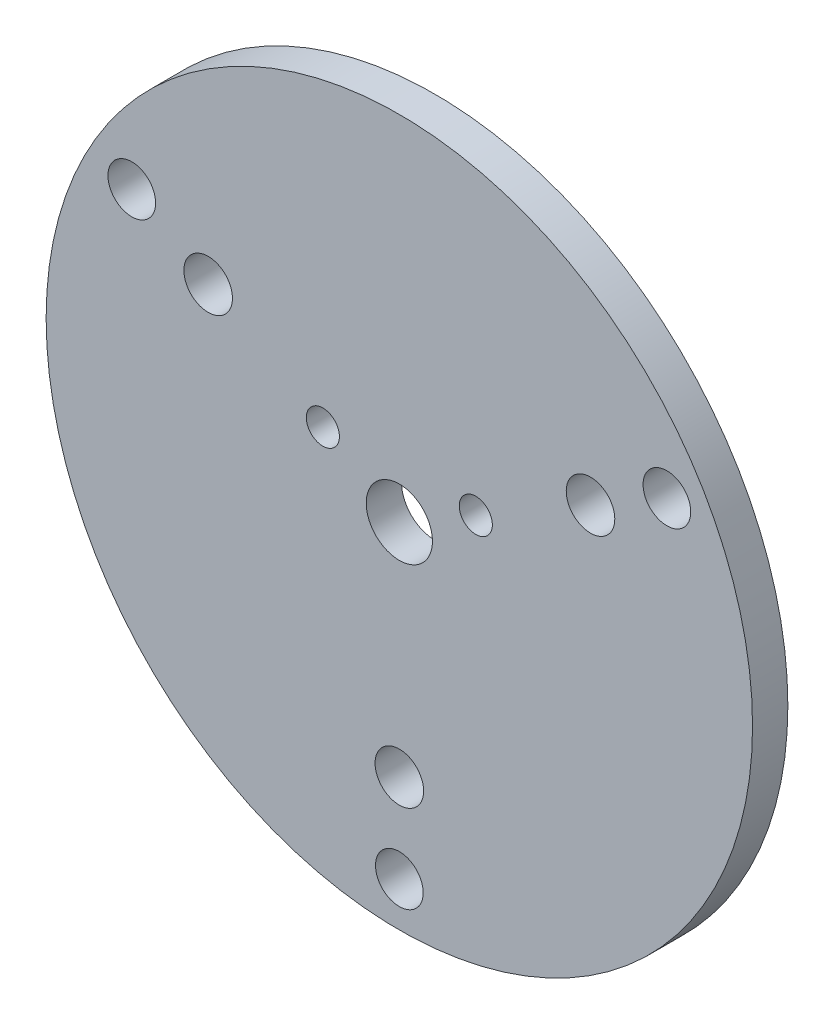
ISO-10303-21;
HEADER;
FILE_DESCRIPTION(('STEP AP214'),'2;1');
FILE_NAME('part.step','',(''),(''),'','','');
FILE_SCHEMA(('AUTOMOTIVE_DESIGN { 1 0 10303 214 1 1 1 1 }'));
ENDSEC;
DATA;
#1=APPLICATION_CONTEXT('core data for automotive mechanical design processes');
#2=APPLICATION_PROTOCOL_DEFINITION('international standard','automotive_design',2000,#1);
#3=PRODUCT_CONTEXT('',#1,'mechanical');
#4=PRODUCT('Part','Part','',(#3));
#5=PRODUCT_RELATED_PRODUCT_CATEGORY('part','',(#4));
#6=PRODUCT_DEFINITION_FORMATION('','',#4);
#7=PRODUCT_DEFINITION_CONTEXT('part definition',#1,'design');
#8=PRODUCT_DEFINITION('design','',#6,#7);
#9=PRODUCT_DEFINITION_SHAPE('','',#8);
#10=(LENGTH_UNIT() NAMED_UNIT(*) SI_UNIT(.MILLI.,.METRE.));
#11=(NAMED_UNIT(*) PLANE_ANGLE_UNIT() SI_UNIT($,.RADIAN.));
#12=(NAMED_UNIT(*) SI_UNIT($,.STERADIAN.) SOLID_ANGLE_UNIT());
#13=UNCERTAINTY_MEASURE_WITH_UNIT(LENGTH_MEASURE(1.E-05),#10,'distance_accuracy_value','');
#14=(GEOMETRIC_REPRESENTATION_CONTEXT(3) GLOBAL_UNCERTAINTY_ASSIGNED_CONTEXT((#13)) GLOBAL_UNIT_ASSIGNED_CONTEXT((#10,
#11,#12)) REPRESENTATION_CONTEXT('',''));
#15=CARTESIAN_POINT('',(0.,0.,0.));
#16=DIRECTION('',(0.,0.,1.));
#17=DIRECTION('',(1.,0.,0.));
#18=AXIS2_PLACEMENT_3D('',#15,#16,#17);
#19=CARTESIAN_POINT('',(12.12,7.,0.));
#20=DIRECTION('',(0.,0.,-1.));
#21=DIRECTION('',(1.,0.,0.));
#22=AXIS2_PLACEMENT_3D('',#19,#20,#21);
#23=CYLINDRICAL_SURFACE('',#22,1.08);
#24=DIRECTION('',(0.,0.,1.));
#25=VECTOR('',#24,1.);
#26=CARTESIAN_POINT('',(13.2,7.,0.));
#27=LINE('',#26,#25);
#28=CARTESIAN_POINT('',(13.2,7.,0.));
#29=VERTEX_POINT('',#28);
#30=CARTESIAN_POINT('',(13.2,7.,1.6));
#31=VERTEX_POINT('',#30);
#32=EDGE_CURVE('E11',#29,#31,#27,.T.);
#33=ORIENTED_EDGE('',*,*,#32,.T.);
#34=CARTESIAN_POINT('',(12.12,7.,1.6));
#35=DIRECTION('',(0.,0.,1.));
#36=DIRECTION('',(1.,0.,0.));
#37=AXIS2_PLACEMENT_3D('',#34,#35,#36);
#38=CIRCLE('',#37,1.08);
#39=EDGE_CURVE('E157',#31,#31,#38,.T.);
#40=ORIENTED_EDGE('',*,*,#39,.T.);
#41=ORIENTED_EDGE('',*,*,#32,.F.);
#42=CARTESIAN_POINT('',(12.12,7.,0.));
#43=DIRECTION('',(0.,0.,1.));
#44=DIRECTION('',(1.,0.,0.));
#45=AXIS2_PLACEMENT_3D('',#42,#43,#44);
#46=CIRCLE('',#45,1.08);
#47=EDGE_CURVE('E166',#29,#29,#46,.T.);
#48=ORIENTED_EDGE('',*,*,#47,.F.);
#49=EDGE_LOOP('',(#33,#40,#41,#48));
#50=FACE_BOUND('',#49,.T.);
#51=ADVANCED_FACE('F17',(#50),#23,.F.);
#52=CARTESIAN_POINT('',(8.66,5.,-0.045));
#53=DIRECTION('',(0.,0.,-1.));
#54=DIRECTION('',(0.,-1.,0.));
#55=AXIS2_PLACEMENT_3D('',#52,#53,#54);
#56=CYLINDRICAL_SURFACE('',#55,1.1);
#57=CARTESIAN_POINT('',(8.66,5.,0.));
#58=DIRECTION('',(0.,0.,-1.));
#59=DIRECTION('',(0.,-1.,0.));
#60=AXIS2_PLACEMENT_3D('',#57,#58,#59);
#61=CIRCLE('',#60,1.1);
#62=CARTESIAN_POINT('',(8.66,3.9,0.));
#63=VERTEX_POINT('',#62);
#64=EDGE_CURVE('E165',#63,#63,#61,.T.);
#65=ORIENTED_EDGE('',*,*,#64,.T.);
#66=DIRECTION('',(0.,0.,1.));
#67=VECTOR('',#66,1.);
#68=CARTESIAN_POINT('',(8.66,3.9,-0.045));
#69=LINE('',#68,#67);
#70=CARTESIAN_POINT('',(8.66,3.9,1.6));
#71=VERTEX_POINT('',#70);
#72=EDGE_CURVE('E25',#63,#71,#69,.T.);
#73=ORIENTED_EDGE('',*,*,#72,.T.);
#74=CARTESIAN_POINT('',(8.66,5.,1.6));
#75=DIRECTION('',(0.,0.,-1.));
#76=DIRECTION('',(0.,-1.,0.));
#77=AXIS2_PLACEMENT_3D('',#74,#75,#76);
#78=CIRCLE('',#77,1.1);
#79=EDGE_CURVE('E202',#71,#71,#78,.T.);
#80=ORIENTED_EDGE('',*,*,#79,.F.);
#81=ORIENTED_EDGE('',*,*,#72,.F.);
#82=EDGE_LOOP('',(#65,#73,#80,#81));
#83=FACE_BOUND('',#82,.T.);
#84=ADVANCED_FACE('F347',(#83),#56,.F.);
#85=CARTESIAN_POINT('',(3.4641,2.,-0.045));
#86=DIRECTION('',(0.,0.,-1.));
#87=DIRECTION('',(0.,-1.,0.));
#88=AXIS2_PLACEMENT_3D('',#85,#86,#87);
#89=CYLINDRICAL_SURFACE('',#88,0.75);
#90=CARTESIAN_POINT('',(3.4641,2.,0.));
#91=DIRECTION('',(0.,0.,-1.));
#92=DIRECTION('',(0.,-1.,0.));
#93=AXIS2_PLACEMENT_3D('',#90,#91,#92);
#94=CIRCLE('',#93,0.75);
#95=CARTESIAN_POINT('',(3.4641,1.25,0.));
#96=VERTEX_POINT('',#95);
#97=EDGE_CURVE('E161',#96,#96,#94,.T.);
#98=ORIENTED_EDGE('',*,*,#97,.T.);
#99=DIRECTION('',(0.,0.,1.));
#100=VECTOR('',#99,1.);
#101=CARTESIAN_POINT('',(3.4641,1.25,-0.045));
#102=LINE('',#101,#100);
#103=CARTESIAN_POINT('',(3.4641,1.25,1.6));
#104=VERTEX_POINT('',#103);
#105=EDGE_CURVE('E216',#96,#104,#102,.T.);
#106=ORIENTED_EDGE('',*,*,#105,.T.);
#107=CARTESIAN_POINT('',(3.4641,2.,1.6));
#108=DIRECTION('',(0.,0.,-1.));
#109=DIRECTION('',(0.,-1.,0.));
#110=AXIS2_PLACEMENT_3D('',#107,#108,#109);
#111=CIRCLE('',#110,0.75);
#112=EDGE_CURVE('E198',#104,#104,#111,.T.);
#113=ORIENTED_EDGE('',*,*,#112,.F.);
#114=ORIENTED_EDGE('',*,*,#105,.F.);
#115=EDGE_LOOP('',(#98,#106,#113,#114));
#116=FACE_BOUND('',#115,.T.);
#117=ADVANCED_FACE('F351',(#116),#89,.F.);
#118=CARTESIAN_POINT('',(0.,0.,0.));
#119=DIRECTION('',(0.,0.,-1.));
#120=DIRECTION('',(1.,0.,0.));
#121=AXIS2_PLACEMENT_3D('',#118,#119,#120);
#122=CYLINDRICAL_SURFACE('',#121,1.5);
#123=DIRECTION('',(0.,0.,1.));
#124=VECTOR('',#123,1.);
#125=CARTESIAN_POINT('',(1.5,0.,0.));
#126=LINE('',#125,#124);
#127=CARTESIAN_POINT('',(1.5,0.,0.));
#128=VERTEX_POINT('',#127);
#129=CARTESIAN_POINT('',(1.5,0.,1.6));
#130=VERTEX_POINT('',#129);
#131=EDGE_CURVE('E213',#128,#130,#126,.T.);
#132=ORIENTED_EDGE('',*,*,#131,.T.);
#133=CARTESIAN_POINT('',(0.,0.,1.6));
#134=DIRECTION('',(0.,0.,1.));
#135=DIRECTION('',(1.,0.,0.));
#136=AXIS2_PLACEMENT_3D('',#133,#134,#135);
#137=CIRCLE('',#136,1.5);
#138=EDGE_CURVE('E194',#130,#130,#137,.T.);
#139=ORIENTED_EDGE('',*,*,#138,.T.);
#140=ORIENTED_EDGE('',*,*,#131,.F.);
#141=CARTESIAN_POINT('',(0.,0.,0.));
#142=DIRECTION('',(0.,0.,1.));
#143=DIRECTION('',(1.,0.,0.));
#144=AXIS2_PLACEMENT_3D('',#141,#142,#143);
#145=CIRCLE('',#144,1.5);
#146=EDGE_CURVE('E152',#128,#128,#145,.T.);
#147=ORIENTED_EDGE('',*,*,#146,.F.);
#148=EDGE_LOOP('',(#132,#139,#140,#147));
#149=FACE_BOUND('',#148,.T.);
#150=ADVANCED_FACE('F355',(#149),#122,.F.);
#151=CARTESIAN_POINT('',(-12.12,7.,0.));
#152=DIRECTION('',(0.,0.,-1.));
#153=DIRECTION('',(1.,0.,0.));
#154=AXIS2_PLACEMENT_3D('',#151,#152,#153);
#155=CYLINDRICAL_SURFACE('',#154,1.08);
#156=DIRECTION('',(0.,0.,1.));
#157=VECTOR('',#156,1.);
#158=CARTESIAN_POINT('',(-11.04,7.,0.));
#159=LINE('',#158,#157);
#160=CARTESIAN_POINT('',(-11.04,7.,0.));
#161=VERTEX_POINT('',#160);
#162=CARTESIAN_POINT('',(-11.04,7.,1.6));
#163=VERTEX_POINT('',#162);
#164=EDGE_CURVE('E176',#161,#163,#159,.T.);
#165=ORIENTED_EDGE('',*,*,#164,.T.);
#166=CARTESIAN_POINT('',(-12.12,7.,1.6));
#167=DIRECTION('',(0.,0.,1.));
#168=DIRECTION('',(1.,0.,0.));
#169=AXIS2_PLACEMENT_3D('',#166,#167,#168);
#170=CIRCLE('',#169,1.08);
#171=EDGE_CURVE('E186',#163,#163,#170,.T.);
#172=ORIENTED_EDGE('',*,*,#171,.T.);
#173=ORIENTED_EDGE('',*,*,#164,.F.);
#174=CARTESIAN_POINT('',(-12.12,7.,0.));
#175=DIRECTION('',(0.,0.,1.));
#176=DIRECTION('',(1.,0.,0.));
#177=AXIS2_PLACEMENT_3D('',#174,#175,#176);
#178=CIRCLE('',#177,1.08);
#179=EDGE_CURVE('E144',#161,#161,#178,.T.);
#180=ORIENTED_EDGE('',*,*,#179,.F.);
#181=EDGE_LOOP('',(#165,#172,#173,#180));
#182=FACE_BOUND('',#181,.T.);
#183=ADVANCED_FACE('F359',(#182),#155,.F.);
#184=CARTESIAN_POINT('',(-8.66,5.,-0.045));
#185=DIRECTION('',(0.,0.,-1.));
#186=DIRECTION('',(0.,-1.,0.));
#187=AXIS2_PLACEMENT_3D('',#184,#185,#186);
#188=CYLINDRICAL_SURFACE('',#187,1.1);
#189=CARTESIAN_POINT('',(-8.66,5.,0.));
#190=DIRECTION('',(0.,0.,-1.));
#191=DIRECTION('',(0.,-1.,0.));
#192=AXIS2_PLACEMENT_3D('',#189,#190,#191);
#193=CIRCLE('',#192,1.1);
#194=CARTESIAN_POINT('',(-8.66,3.9,0.));
#195=VERTEX_POINT('',#194);
#196=EDGE_CURVE('E140',#195,#195,#193,.T.);
#197=ORIENTED_EDGE('',*,*,#196,.T.);
#198=DIRECTION('',(0.,0.,1.));
#199=VECTOR('',#198,1.);
#200=CARTESIAN_POINT('',(-8.66,3.9,-0.045));
#201=LINE('',#200,#199);
#202=CARTESIAN_POINT('',(-8.66,3.9,1.6));
#203=VERTEX_POINT('',#202);
#204=EDGE_CURVE('E173',#195,#203,#201,.T.);
#205=ORIENTED_EDGE('',*,*,#204,.T.);
#206=CARTESIAN_POINT('',(-8.66,5.,1.6));
#207=DIRECTION('',(0.,0.,-1.));
#208=DIRECTION('',(0.,-1.,0.));
#209=AXIS2_PLACEMENT_3D('',#206,#207,#208);
#210=CIRCLE('',#209,1.1);
#211=EDGE_CURVE('E182',#203,#203,#210,.T.);
#212=ORIENTED_EDGE('',*,*,#211,.F.);
#213=ORIENTED_EDGE('',*,*,#204,.F.);
#214=EDGE_LOOP('',(#197,#205,#212,#213));
#215=FACE_BOUND('',#214,.T.);
#216=ADVANCED_FACE('F362',(#215),#188,.F.);
#217=CARTESIAN_POINT('',(-3.4641,2.,-0.045));
#218=DIRECTION('',(0.,0.,-1.));
#219=DIRECTION('',(0.,-1.,0.));
#220=AXIS2_PLACEMENT_3D('',#217,#218,#219);
#221=CYLINDRICAL_SURFACE('',#220,0.75);
#222=CARTESIAN_POINT('',(-3.4641,2.,0.));
#223=DIRECTION('',(0.,0.,-1.));
#224=DIRECTION('',(0.,-1.,0.));
#225=AXIS2_PLACEMENT_3D('',#222,#223,#224);
#226=CIRCLE('',#225,0.75);
#227=CARTESIAN_POINT('',(-3.4641,1.25,0.));
#228=VERTEX_POINT('',#227);
#229=EDGE_CURVE('E145',#228,#228,#226,.T.);
#230=ORIENTED_EDGE('',*,*,#229,.T.);
#231=DIRECTION('',(0.,0.,1.));
#232=VECTOR('',#231,1.);
#233=CARTESIAN_POINT('',(-3.4641,1.25,-0.045));
#234=LINE('',#233,#232);
#235=CARTESIAN_POINT('',(-3.4641,1.25,1.6));
#236=VERTEX_POINT('',#235);
#237=EDGE_CURVE('E177',#228,#236,#234,.T.);
#238=ORIENTED_EDGE('',*,*,#237,.T.);
#239=CARTESIAN_POINT('',(-3.4641,2.,1.6));
#240=DIRECTION('',(0.,0.,-1.));
#241=DIRECTION('',(0.,-1.,0.));
#242=AXIS2_PLACEMENT_3D('',#239,#240,#241);
#243=CIRCLE('',#242,0.75);
#244=EDGE_CURVE('E187',#236,#236,#243,.T.);
#245=ORIENTED_EDGE('',*,*,#244,.F.);
#246=ORIENTED_EDGE('',*,*,#237,.F.);
#247=EDGE_LOOP('',(#230,#238,#245,#246));
#248=FACE_BOUND('',#247,.T.);
#249=ADVANCED_FACE('F317',(#248),#221,.F.);
#250=CARTESIAN_POINT('',(0.,-10.,-0.045));
#251=DIRECTION('',(0.,0.,-1.));
#252=DIRECTION('',(0.,-1.,0.));
#253=AXIS2_PLACEMENT_3D('',#250,#251,#252);
#254=CYLINDRICAL_SURFACE('',#253,1.1);
#255=CARTESIAN_POINT('',(0.,-10.,0.));
#256=DIRECTION('',(0.,0.,-1.));
#257=DIRECTION('',(0.,-1.,0.));
#258=AXIS2_PLACEMENT_3D('',#255,#256,#257);
#259=CIRCLE('',#258,1.1);
#260=CARTESIAN_POINT('',(0.,-11.1,0.));
#261=VERTEX_POINT('',#260);
#262=EDGE_CURVE('E139',#261,#261,#259,.T.);
#263=ORIENTED_EDGE('',*,*,#262,.T.);
#264=DIRECTION('',(0.,0.,1.));
#265=VECTOR('',#264,1.);
#266=CARTESIAN_POINT('',(0.,-11.1,-0.045));
#267=LINE('',#266,#265);
#268=CARTESIAN_POINT('',(0.,-11.1,1.6));
#269=VERTEX_POINT('',#268);
#270=EDGE_CURVE('E156',#261,#269,#267,.T.);
#271=ORIENTED_EDGE('',*,*,#270,.T.);
#272=CARTESIAN_POINT('',(0.,-10.,1.6));
#273=DIRECTION('',(0.,0.,-1.));
#274=DIRECTION('',(0.,-1.,0.));
#275=AXIS2_PLACEMENT_3D('',#272,#273,#274);
#276=CIRCLE('',#275,1.1);
#277=EDGE_CURVE('E181',#269,#269,#276,.T.);
#278=ORIENTED_EDGE('',*,*,#277,.F.);
#279=ORIENTED_EDGE('',*,*,#270,.F.);
#280=EDGE_LOOP('',(#263,#271,#278,#279));
#281=FACE_BOUND('',#280,.T.);
#282=ADVANCED_FACE('F342',(#281),#254,.F.);
#283=CARTESIAN_POINT('',(0.,-14.,0.));
#284=DIRECTION('',(0.,0.,-1.));
#285=DIRECTION('',(1.,0.,0.));
#286=AXIS2_PLACEMENT_3D('',#283,#284,#285);
#287=CYLINDRICAL_SURFACE('',#286,1.08);
#288=DIRECTION('',(0.,0.,1.));
#289=VECTOR('',#288,1.);
#290=CARTESIAN_POINT('',(1.08,-14.,0.));
#291=LINE('',#290,#289);
#292=CARTESIAN_POINT('',(1.08,-14.,0.));
#293=VERTEX_POINT('',#292);
#294=CARTESIAN_POINT('',(1.08,-14.,1.6));
#295=VERTEX_POINT('',#294);
#296=EDGE_CURVE('E153',#293,#295,#291,.T.);
#297=ORIENTED_EDGE('',*,*,#296,.T.);
#298=CARTESIAN_POINT('',(0.,-14.,1.6));
#299=DIRECTION('',(0.,0.,1.));
#300=DIRECTION('',(1.,0.,0.));
#301=AXIS2_PLACEMENT_3D('',#298,#299,#300);
#302=CIRCLE('',#301,1.08);
#303=EDGE_CURVE('E170',#295,#295,#302,.T.);
#304=ORIENTED_EDGE('',*,*,#303,.T.);
#305=ORIENTED_EDGE('',*,*,#296,.F.);
#306=CARTESIAN_POINT('',(0.,-14.,0.));
#307=DIRECTION('',(0.,0.,1.));
#308=DIRECTION('',(1.,0.,0.));
#309=AXIS2_PLACEMENT_3D('',#306,#307,#308);
#310=CIRCLE('',#309,1.08);
#311=EDGE_CURVE('E131',#293,#293,#310,.T.);
#312=ORIENTED_EDGE('',*,*,#311,.F.);
#313=EDGE_LOOP('',(#297,#304,#305,#312));
#314=FACE_BOUND('',#313,.T.);
#315=ADVANCED_FACE('F331',(#314),#287,.F.);
#316=CARTESIAN_POINT('',(0.,0.,1.6));
#317=DIRECTION('',(0.,0.,1.));
#318=DIRECTION('',(1.,0.,0.));
#319=AXIS2_PLACEMENT_3D('',#316,#317,#318);
#320=PLANE('',#319);
#321=ORIENTED_EDGE('',*,*,#39,.F.);
#322=EDGE_LOOP('',(#321));
#323=FACE_BOUND('',#322,.T.);
#324=ORIENTED_EDGE('',*,*,#79,.T.);
#325=EDGE_LOOP('',(#324));
#326=FACE_BOUND('',#325,.T.);
#327=ORIENTED_EDGE('',*,*,#112,.T.);
#328=EDGE_LOOP('',(#327));
#329=FACE_BOUND('',#328,.T.);
#330=ORIENTED_EDGE('',*,*,#138,.F.);
#331=EDGE_LOOP('',(#330));
#332=FACE_BOUND('',#331,.T.);
#333=ORIENTED_EDGE('',*,*,#171,.F.);
#334=EDGE_LOOP('',(#333));
#335=FACE_BOUND('',#334,.T.);
#336=ORIENTED_EDGE('',*,*,#211,.T.);
#337=EDGE_LOOP('',(#336));
#338=FACE_BOUND('',#337,.T.);
#339=ORIENTED_EDGE('',*,*,#244,.T.);
#340=EDGE_LOOP('',(#339));
#341=FACE_BOUND('',#340,.T.);
#342=ORIENTED_EDGE('',*,*,#277,.T.);
#343=EDGE_LOOP('',(#342));
#344=FACE_BOUND('',#343,.T.);
#345=ORIENTED_EDGE('',*,*,#303,.F.);
#346=EDGE_LOOP('',(#345));
#347=FACE_BOUND('',#346,.T.);
#348=CARTESIAN_POINT('',(0.,0.,1.6));
#349=DIRECTION('',(0.,0.,1.));
#350=DIRECTION('',(1.,0.,0.));
#351=AXIS2_PLACEMENT_3D('',#348,#349,#350);
#352=CIRCLE('',#351,16.);
#353=CARTESIAN_POINT('',(16.,0.,1.6));
#354=VERTEX_POINT('',#353);
#355=EDGE_CURVE('E123',#354,#354,#352,.T.);
#356=ORIENTED_EDGE('',*,*,#355,.T.);
#357=EDGE_LOOP('',(#356));
#358=FACE_BOUND('',#357,.T.);
#359=ADVANCED_FACE('F323',(#323,#326,#329,#332,#335,#338,#341,#344,#347,#358),#320,.T.);
#360=CARTESIAN_POINT('',(0.,0.,0.));
#361=DIRECTION('',(0.,0.,1.));
#362=DIRECTION('',(1.,0.,0.));
#363=AXIS2_PLACEMENT_3D('',#360,#361,#362);
#364=PLANE('',#363);
#365=ORIENTED_EDGE('',*,*,#47,.T.);
#366=EDGE_LOOP('',(#365));
#367=FACE_BOUND('',#366,.T.);
#368=ORIENTED_EDGE('',*,*,#64,.F.);
#369=EDGE_LOOP('',(#368));
#370=FACE_BOUND('',#369,.T.);
#371=ORIENTED_EDGE('',*,*,#97,.F.);
#372=EDGE_LOOP('',(#371));
#373=FACE_BOUND('',#372,.T.);
#374=ORIENTED_EDGE('',*,*,#146,.T.);
#375=EDGE_LOOP('',(#374));
#376=FACE_BOUND('',#375,.T.);
#377=ORIENTED_EDGE('',*,*,#179,.T.);
#378=EDGE_LOOP('',(#377));
#379=FACE_BOUND('',#378,.T.);
#380=ORIENTED_EDGE('',*,*,#196,.F.);
#381=EDGE_LOOP('',(#380));
#382=FACE_BOUND('',#381,.T.);
#383=ORIENTED_EDGE('',*,*,#229,.F.);
#384=EDGE_LOOP('',(#383));
#385=FACE_BOUND('',#384,.T.);
#386=ORIENTED_EDGE('',*,*,#262,.F.);
#387=EDGE_LOOP('',(#386));
#388=FACE_BOUND('',#387,.T.);
#389=ORIENTED_EDGE('',*,*,#311,.T.);
#390=EDGE_LOOP('',(#389));
#391=FACE_BOUND('',#390,.T.);
#392=CARTESIAN_POINT('',(0.,0.,0.));
#393=DIRECTION('',(0.,0.,1.));
#394=DIRECTION('',(1.,0.,0.));
#395=AXIS2_PLACEMENT_3D('',#392,#393,#394);
#396=CIRCLE('',#395,16.);
#397=CARTESIAN_POINT('',(16.,0.,0.));
#398=VERTEX_POINT('',#397);
#399=EDGE_CURVE('E122',#398,#398,#396,.T.);
#400=ORIENTED_EDGE('',*,*,#399,.F.);
#401=EDGE_LOOP('',(#400));
#402=FACE_BOUND('',#401,.T.);
#403=ADVANCED_FACE('F320',(#367,#370,#373,#376,#379,#382,#385,#388,#391,#402),#364,.F.);
#404=CARTESIAN_POINT('',(0.,0.,0.));
#405=DIRECTION('',(0.,0.,-1.));
#406=DIRECTION('',(1.,0.,0.));
#407=AXIS2_PLACEMENT_3D('',#404,#405,#406);
#408=CYLINDRICAL_SURFACE('',#407,16.);
#409=ORIENTED_EDGE('',*,*,#399,.T.);
#410=DIRECTION('',(0.,0.,1.));
#411=VECTOR('',#410,1.);
#412=CARTESIAN_POINT('',(16.,0.,0.));
#413=LINE('',#412,#411);
#414=EDGE_CURVE('E119',#398,#354,#413,.T.);
#415=ORIENTED_EDGE('',*,*,#414,.T.);
#416=ORIENTED_EDGE('',*,*,#355,.F.);
#417=ORIENTED_EDGE('',*,*,#414,.F.);
#418=EDGE_LOOP('',(#409,#415,#416,#417));
#419=FACE_BOUND('',#418,.T.);
#420=ADVANCED_FACE('F120',(#419),#408,.T.);
#421=CLOSED_SHELL('',(#51,#84,#117,#150,#183,#216,#249,#282,#315,#359,#403,#420));
#422=MANIFOLD_SOLID_BREP('B1',#421);
#423=ADVANCED_BREP_SHAPE_REPRESENTATION('',(#18,#422),#14);
#424=SHAPE_DEFINITION_REPRESENTATION(#9,#423);
ENDSEC;
END-ISO-10303-21;
